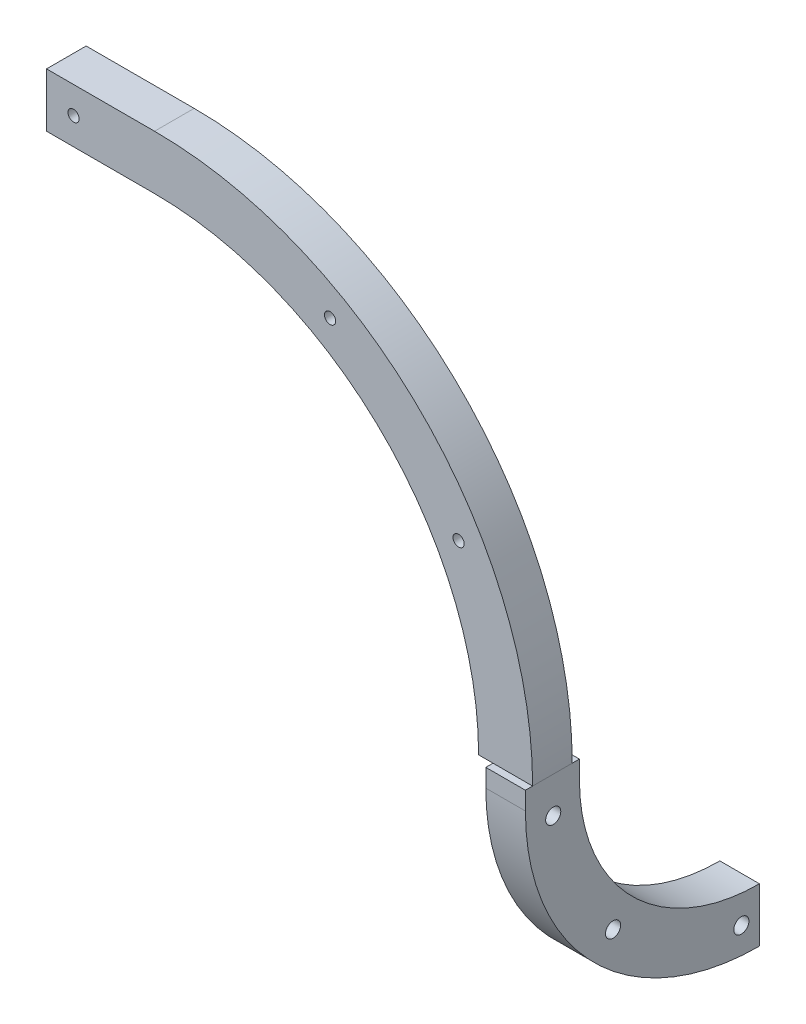
ISO-10303-21;
HEADER;
FILE_DESCRIPTION(('STEP AP214'),'2;1');
FILE_NAME('part.step','',(''),(''),'','','');
FILE_SCHEMA(('AUTOMOTIVE_DESIGN { 1 0 10303 214 1 1 1 1 }'));
ENDSEC;
DATA;
#1=APPLICATION_CONTEXT('core data for automotive mechanical design processes');
#2=APPLICATION_PROTOCOL_DEFINITION('international standard','automotive_design',2000,#1);
#3=PRODUCT_CONTEXT('',#1,'mechanical');
#4=PRODUCT('Part','Part','',(#3));
#5=PRODUCT_RELATED_PRODUCT_CATEGORY('part','',(#4));
#6=PRODUCT_DEFINITION_FORMATION('','',#4);
#7=PRODUCT_DEFINITION_CONTEXT('part definition',#1,'design');
#8=PRODUCT_DEFINITION('design','',#6,#7);
#9=PRODUCT_DEFINITION_SHAPE('','',#8);
#10=(LENGTH_UNIT() NAMED_UNIT(*) SI_UNIT(.MILLI.,.METRE.));
#11=(NAMED_UNIT(*) PLANE_ANGLE_UNIT() SI_UNIT($,.RADIAN.));
#12=(NAMED_UNIT(*) SI_UNIT($,.STERADIAN.) SOLID_ANGLE_UNIT());
#13=UNCERTAINTY_MEASURE_WITH_UNIT(LENGTH_MEASURE(1.E-05),#10,'distance_accuracy_value','');
#14=(GEOMETRIC_REPRESENTATION_CONTEXT(3) GLOBAL_UNCERTAINTY_ASSIGNED_CONTEXT((#13)) GLOBAL_UNIT_ASSIGNED_CONTEXT((#10,
#11,#12)) REPRESENTATION_CONTEXT('',''));
#15=CARTESIAN_POINT('',(0.,0.,0.));
#16=DIRECTION('',(0.,0.,1.));
#17=DIRECTION('',(1.,0.,0.));
#18=AXIS2_PLACEMENT_3D('',#15,#16,#17);
#19=CARTESIAN_POINT('',(0.,-45.6586399182266,-9.3413600817736));
#20=DIRECTION('',(1.,0.,0.));
#21=DIRECTION('',(0.,0.,-1.));
#22=AXIS2_PLACEMENT_3D('',#19,#20,#21);
#23=CYLINDRICAL_SURFACE('',#22,1.55);
#24=CARTESIAN_POINT('',(94.,-45.6586399182266,-9.3413600817736));
#25=DIRECTION('',(-1.,0.,0.));
#26=DIRECTION('',(0.,0.,1.));
#27=AXIS2_PLACEMENT_3D('',#24,#25,#26);
#28=CIRCLE('',#27,1.55);
#29=CARTESIAN_POINT('',(94.,-45.6586399182266,-7.7913600817736));
#30=VERTEX_POINT('',#29);
#31=EDGE_CURVE('E316',#30,#30,#28,.F.);
#32=ORIENTED_EDGE('',*,*,#31,.F.);
#33=EDGE_LOOP('',(#32));
#34=FACE_BOUND('',#33,.T.);
#35=CARTESIAN_POINT('',(100.5,-45.6586399182266,-9.3413600817736));
#36=DIRECTION('',(1.,0.,0.));
#37=DIRECTION('',(0.,0.,-1.));
#38=AXIS2_PLACEMENT_3D('',#35,#36,#37);
#39=CIRCLE('',#38,1.55);
#40=CARTESIAN_POINT('',(100.5,-45.6586399182266,-10.8913600817736));
#41=VERTEX_POINT('',#40);
#42=EDGE_CURVE('E156',#41,#41,#39,.F.);
#43=ORIENTED_EDGE('',*,*,#42,.F.);
#44=EDGE_LOOP('',(#43));
#45=FACE_BOUND('',#44,.T.);
#46=ADVANCED_FACE('F45',(#34,#45),#23,.F.);
#47=CARTESIAN_POINT('',(0.,-10.01145520799,7.2811951402754));
#48=DIRECTION('',(1.,0.,0.));
#49=DIRECTION('',(0.,0.,-1.));
#50=AXIS2_PLACEMENT_3D('',#47,#48,#49);
#51=CYLINDRICAL_SURFACE('',#50,1.55);
#52=CARTESIAN_POINT('',(94.,-10.01145520799,7.2811951402754));
#53=DIRECTION('',(-1.,0.,0.));
#54=DIRECTION('',(0.,0.,1.));
#55=AXIS2_PLACEMENT_3D('',#52,#53,#54);
#56=CIRCLE('',#55,1.55);
#57=CARTESIAN_POINT('',(94.,-10.01145520799,8.8311951402754));
#58=VERTEX_POINT('',#57);
#59=EDGE_CURVE('E208',#58,#58,#56,.F.);
#60=ORIENTED_EDGE('',*,*,#59,.F.);
#61=EDGE_LOOP('',(#60));
#62=FACE_BOUND('',#61,.T.);
#63=CARTESIAN_POINT('',(100.5,-10.01145520799,7.2811951402754));
#64=DIRECTION('',(1.,0.,0.));
#65=DIRECTION('',(0.,0.,-1.));
#66=AXIS2_PLACEMENT_3D('',#63,#64,#65);
#67=CIRCLE('',#66,1.55);
#68=CARTESIAN_POINT('',(100.5,-10.01145520799,5.7311951402754));
#69=VERTEX_POINT('',#68);
#70=EDGE_CURVE('E219',#69,#69,#67,.F.);
#71=ORIENTED_EDGE('',*,*,#70,.F.);
#72=EDGE_LOOP('',(#71));
#73=FACE_BOUND('',#72,.T.);
#74=ADVANCED_FACE('F232',(#62,#73),#51,.F.);
#75=CARTESIAN_POINT('',(0.,-62.5,-44.9694018472598));
#76=DIRECTION('',(1.,0.,0.));
#77=DIRECTION('',(0.,0.,-1.));
#78=AXIS2_PLACEMENT_3D('',#75,#76,#77);
#79=CYLINDRICAL_SURFACE('',#78,1.55);
#80=CARTESIAN_POINT('',(94.,-62.5,-44.9694018472598));
#81=DIRECTION('',(-1.,0.,0.));
#82=DIRECTION('',(0.,0.,1.));
#83=AXIS2_PLACEMENT_3D('',#80,#81,#82);
#84=CIRCLE('',#83,1.55);
#85=CARTESIAN_POINT('',(94.,-62.5,-43.4194018472598));
#86=VERTEX_POINT('',#85);
#87=EDGE_CURVE('E167',#86,#86,#84,.F.);
#88=ORIENTED_EDGE('',*,*,#87,.F.);
#89=EDGE_LOOP('',(#88));
#90=FACE_BOUND('',#89,.T.);
#91=CARTESIAN_POINT('',(100.5,-62.5,-44.9694018472598));
#92=DIRECTION('',(1.,0.,0.));
#93=DIRECTION('',(0.,0.,-1.));
#94=AXIS2_PLACEMENT_3D('',#91,#92,#93);
#95=CIRCLE('',#94,1.55);
#96=CARTESIAN_POINT('',(100.5,-62.5,-46.5194018472598));
#97=VERTEX_POINT('',#96);
#98=EDGE_CURVE('E215',#97,#97,#95,.F.);
#99=ORIENTED_EDGE('',*,*,#98,.F.);
#100=EDGE_LOOP('',(#99));
#101=FACE_BOUND('',#100,.T.);
#102=ADVANCED_FACE('F237',(#90,#101),#79,.F.);
#103=CARTESIAN_POINT('',(0.,0.,0.));
#104=DIRECTION('',(0.,0.,-1.));
#105=DIRECTION('',(-1.,0.,0.));
#106=AXIS2_PLACEMENT_3D('',#103,#104,#105);
#107=PLANE('',#106);
#108=DIRECTION('',(1.,0.,0.));
#109=VECTOR('',#108,1.);
#110=CARTESIAN_POINT('',(90.,-5.,0.));
#111=LINE('',#110,#109);
#112=CARTESIAN_POINT('',(94.,-5.,0.));
#113=VERTEX_POINT('',#112);
#114=CARTESIAN_POINT('',(105.,-5.,0.));
#115=VERTEX_POINT('',#114);
#116=EDGE_CURVE('E174',#113,#115,#111,.T.);
#117=ORIENTED_EDGE('',*,*,#116,.F.);
#118=DIRECTION('',(0.,1.,0.));
#119=VECTOR('',#118,1.);
#120=CARTESIAN_POINT('',(94.,0.,0.));
#121=LINE('',#120,#119);
#122=CARTESIAN_POINT('',(94.,0.,0.));
#123=VERTEX_POINT('',#122);
#124=EDGE_CURVE('E361',#113,#123,#121,.T.);
#125=ORIENTED_EDGE('',*,*,#124,.T.);
#126=DIRECTION('',(1.,0.,0.));
#127=VECTOR('',#126,1.);
#128=CARTESIAN_POINT('',(90.,0.,0.));
#129=LINE('',#128,#127);
#130=CARTESIAN_POINT('',(105.,0.,0.));
#131=VERTEX_POINT('',#130);
#132=EDGE_CURVE('E295',#123,#131,#129,.T.);
#133=ORIENTED_EDGE('',*,*,#132,.T.);
#134=DIRECTION('',(0.,1.,0.));
#135=VECTOR('',#134,1.);
#136=CARTESIAN_POINT('',(105.,-5.,0.));
#137=LINE('',#136,#135);
#138=EDGE_CURVE('E178',#115,#131,#137,.T.);
#139=ORIENTED_EDGE('',*,*,#138,.F.);
#140=EDGE_LOOP('',(#117,#125,#133,#139));
#141=FACE_BOUND('',#140,.T.);
#142=ADVANCED_FACE('F270',(#141),#107,.T.);
#143=CARTESIAN_POINT('',(0.,0.,15.));
#144=DIRECTION('',(0.,0.,-1.));
#145=DIRECTION('',(-1.,0.,0.));
#146=AXIS2_PLACEMENT_3D('',#143,#144,#145);
#147=PLANE('',#146);
#148=DIRECTION('',(0.,-1.,0.));
#149=VECTOR('',#148,1.);
#150=CARTESIAN_POINT('',(94.,0.,15.));
#151=LINE('',#150,#149);
#152=CARTESIAN_POINT('',(94.,0.,15.));
#153=VERTEX_POINT('',#152);
#154=CARTESIAN_POINT('',(94.,-5.,15.));
#155=VERTEX_POINT('',#154);
#156=EDGE_CURVE('E145',#153,#155,#151,.T.);
#157=ORIENTED_EDGE('',*,*,#156,.T.);
#158=DIRECTION('',(-1.,0.,0.));
#159=VECTOR('',#158,1.);
#160=CARTESIAN_POINT('',(90.,-5.,15.));
#161=LINE('',#160,#159);
#162=CARTESIAN_POINT('',(105.,-5.,15.));
#163=VERTEX_POINT('',#162);
#164=EDGE_CURVE('E150',#163,#155,#161,.T.);
#165=ORIENTED_EDGE('',*,*,#164,.F.);
#166=DIRECTION('',(0.,1.,0.));
#167=VECTOR('',#166,1.);
#168=CARTESIAN_POINT('',(105.,-5.,15.));
#169=LINE('',#168,#167);
#170=CARTESIAN_POINT('',(105.,0.,15.));
#171=VERTEX_POINT('',#170);
#172=EDGE_CURVE('E173',#163,#171,#169,.T.);
#173=ORIENTED_EDGE('',*,*,#172,.T.);
#174=DIRECTION('',(1.,0.,0.));
#175=VECTOR('',#174,1.);
#176=CARTESIAN_POINT('',(90.,0.,15.));
#177=LINE('',#176,#175);
#178=EDGE_CURVE('E152',#153,#171,#177,.T.);
#179=ORIENTED_EDGE('',*,*,#178,.F.);
#180=EDGE_LOOP('',(#157,#165,#173,#179));
#181=FACE_BOUND('',#180,.T.);
#182=ADVANCED_FACE('F147',(#181),#147,.F.);
#183=CARTESIAN_POINT('',(90.,0.,13.));
#184=DIRECTION('',(0.,-1.,0.));
#185=DIRECTION('',(0.,0.,-1.));
#186=AXIS2_PLACEMENT_3D('',#183,#184,#185);
#187=PLANE('',#186);
#188=DIRECTION('',(0.,0.,1.));
#189=VECTOR('',#188,1.);
#190=CARTESIAN_POINT('',(94.,0.,0.));
#191=LINE('',#190,#189);
#192=CARTESIAN_POINT('',(94.,0.,13.));
#193=VERTEX_POINT('',#192);
#194=EDGE_CURVE('E155',#193,#153,#191,.T.);
#195=ORIENTED_EDGE('',*,*,#194,.T.);
#196=ORIENTED_EDGE('',*,*,#178,.T.);
#197=DIRECTION('',(0.,0.,-1.));
#198=VECTOR('',#197,1.);
#199=CARTESIAN_POINT('',(105.,0.,15.));
#200=LINE('',#199,#198);
#201=CARTESIAN_POINT('',(105.,0.,13.));
#202=VERTEX_POINT('',#201);
#203=EDGE_CURVE('E189',#171,#202,#200,.T.);
#204=ORIENTED_EDGE('',*,*,#203,.T.);
#205=DIRECTION('',(1.,0.,0.));
#206=VECTOR('',#205,1.);
#207=CARTESIAN_POINT('',(90.,0.,13.));
#208=LINE('',#207,#206);
#209=EDGE_CURVE('E326',#193,#202,#208,.T.);
#210=ORIENTED_EDGE('',*,*,#209,.F.);
#211=EDGE_LOOP('',(#195,#196,#204,#210));
#212=FACE_BOUND('',#211,.T.);
#213=ADVANCED_FACE('F269',(#212),#187,.F.);
#214=CARTESIAN_POINT('',(90.,0.,2.));
#215=DIRECTION('',(0.,1.,0.));
#216=DIRECTION('',(0.,0.,1.));
#217=AXIS2_PLACEMENT_3D('',#214,#215,#216);
#218=PLANE('',#217);
#219=ORIENTED_EDGE('',*,*,#132,.F.);
#220=CARTESIAN_POINT('',(94.,0.,2.));
#221=VERTEX_POINT('',#220);
#222=EDGE_CURVE('E434',#123,#221,#191,.T.);
#223=ORIENTED_EDGE('',*,*,#222,.T.);
#224=DIRECTION('',(1.,0.,0.));
#225=VECTOR('',#224,1.);
#226=CARTESIAN_POINT('',(90.,0.,2.));
#227=LINE('',#226,#225);
#228=CARTESIAN_POINT('',(105.,0.,2.));
#229=VERTEX_POINT('',#228);
#230=EDGE_CURVE('E71',#221,#229,#227,.T.);
#231=ORIENTED_EDGE('',*,*,#230,.T.);
#232=DIRECTION('',(0.,0.,-1.));
#233=VECTOR('',#232,1.);
#234=CARTESIAN_POINT('',(105.,0.,2.));
#235=LINE('',#234,#233);
#236=EDGE_CURVE('E214',#229,#131,#235,.T.);
#237=ORIENTED_EDGE('',*,*,#236,.T.);
#238=EDGE_LOOP('',(#219,#223,#231,#237));
#239=FACE_BOUND('',#238,.T.);
#240=ADVANCED_FACE('F277',(#239),#218,.T.);
#241=CARTESIAN_POINT('',(0.,0.,15.));
#242=DIRECTION('',(0.,0.,-1.));
#243=DIRECTION('',(-1.,0.,0.));
#244=AXIS2_PLACEMENT_3D('',#241,#242,#243);
#245=CYLINDRICAL_SURFACE('',#244,105.);
#246=CARTESIAN_POINT('',(0.,0.,2.));
#247=DIRECTION('',(0.,0.,1.));
#248=DIRECTION('',(-1.,0.,0.));
#249=AXIS2_PLACEMENT_3D('',#246,#247,#248);
#250=CIRCLE('',#249,105.);
#251=CARTESIAN_POINT('',(0.,105.,2.));
#252=VERTEX_POINT('',#251);
#253=EDGE_CURVE('E288',#229,#252,#250,.T.);
#254=ORIENTED_EDGE('',*,*,#253,.T.);
#255=DIRECTION('',(0.,0.,-1.));
#256=VECTOR('',#255,1.);
#257=CARTESIAN_POINT('',(0.,105.,15.));
#258=LINE('',#257,#256);
#259=CARTESIAN_POINT('',(0.,105.,13.));
#260=VERTEX_POINT('',#259);
#261=EDGE_CURVE('E11',#260,#252,#258,.T.);
#262=ORIENTED_EDGE('',*,*,#261,.F.);
#263=CARTESIAN_POINT('',(0.,0.,13.));
#264=DIRECTION('',(0.,0.,1.));
#265=DIRECTION('',(-1.,0.,0.));
#266=AXIS2_PLACEMENT_3D('',#263,#264,#265);
#267=CIRCLE('',#266,105.);
#268=EDGE_CURVE('E320',#202,#260,#267,.T.);
#269=ORIENTED_EDGE('',*,*,#268,.F.);
#270=EDGE_CURVE('E188',#202,#229,#200,.T.);
#271=ORIENTED_EDGE('',*,*,#270,.T.);
#272=EDGE_LOOP('',(#254,#262,#269,#271));
#273=FACE_BOUND('',#272,.T.);
#274=ADVANCED_FACE('F47',(#273),#245,.T.);
#275=CARTESIAN_POINT('',(0.,0.,15.));
#276=DIRECTION('',(0.,0.,-1.));
#277=DIRECTION('',(-1.,0.,0.));
#278=AXIS2_PLACEMENT_3D('',#275,#276,#277);
#279=CYLINDRICAL_SURFACE('',#278,90.);
#280=CARTESIAN_POINT('',(0.,0.,2.));
#281=DIRECTION('',(0.,0.,-1.));
#282=DIRECTION('',(-1.,0.,0.));
#283=AXIS2_PLACEMENT_3D('',#280,#281,#282);
#284=CIRCLE('',#283,90.);
#285=CARTESIAN_POINT('',(-3.14233320495882E-13,90.,2.));
#286=VERTEX_POINT('',#285);
#287=CARTESIAN_POINT('',(90.,0.,2.));
#288=VERTEX_POINT('',#287);
#289=EDGE_CURVE('E281',#286,#288,#284,.T.);
#290=ORIENTED_EDGE('',*,*,#289,.T.);
#291=DIRECTION('',(0.,0.,-1.));
#292=VECTOR('',#291,1.);
#293=CARTESIAN_POINT('',(90.,0.,15.));
#294=LINE('',#293,#292);
#295=CARTESIAN_POINT('',(90.,0.,13.));
#296=VERTEX_POINT('',#295);
#297=EDGE_CURVE('E193',#296,#288,#294,.T.);
#298=ORIENTED_EDGE('',*,*,#297,.F.);
#299=CARTESIAN_POINT('',(0.,0.,13.));
#300=DIRECTION('',(0.,0.,-1.));
#301=DIRECTION('',(-1.,0.,0.));
#302=AXIS2_PLACEMENT_3D('',#299,#300,#301);
#303=CIRCLE('',#302,90.);
#304=CARTESIAN_POINT('',(-3.14233320495882E-13,90.,13.));
#305=VERTEX_POINT('',#304);
#306=EDGE_CURVE('E322',#305,#296,#303,.T.);
#307=ORIENTED_EDGE('',*,*,#306,.F.);
#308=DIRECTION('',(0.,0.,-1.));
#309=VECTOR('',#308,1.);
#310=CARTESIAN_POINT('',(0.,90.,15.));
#311=LINE('',#310,#309);
#312=EDGE_CURVE('E55',#305,#286,#311,.T.);
#313=ORIENTED_EDGE('',*,*,#312,.T.);
#314=EDGE_LOOP('',(#290,#298,#307,#313));
#315=FACE_BOUND('',#314,.T.);
#316=ADVANCED_FACE('F251',(#315),#279,.F.);
#317=CARTESIAN_POINT('',(84.4374768689824,48.7500000000007,-50.));
#318=DIRECTION('',(0.,0.,1.));
#319=DIRECTION('',(1.,0.,0.));
#320=AXIS2_PLACEMENT_3D('',#317,#318,#319);
#321=CYLINDRICAL_SURFACE('',#320,1.54999999999999);
#322=CARTESIAN_POINT('',(84.4374768689824,48.7500000000007,13.));
#323=DIRECTION('',(0.,0.,-1.));
#324=DIRECTION('',(-1.,0.,0.));
#325=AXIS2_PLACEMENT_3D('',#322,#323,#324);
#326=CIRCLE('',#325,1.54999999999999);
#327=CARTESIAN_POINT('',(82.8874768689824,48.7500000000007,13.));
#328=VERTEX_POINT('',#327);
#329=EDGE_CURVE('E203',#328,#328,#326,.F.);
#330=ORIENTED_EDGE('',*,*,#329,.T.);
#331=EDGE_LOOP('',(#330));
#332=FACE_BOUND('',#331,.T.);
#333=CARTESIAN_POINT('',(84.4374768689824,48.7500000000007,2.));
#334=DIRECTION('',(0.,0.,-1.));
#335=DIRECTION('',(-1.,0.,0.));
#336=AXIS2_PLACEMENT_3D('',#333,#334,#335);
#337=CIRCLE('',#336,1.54999999999999);
#338=CARTESIAN_POINT('',(82.8874768689824,48.7500000000007,2.));
#339=VERTEX_POINT('',#338);
#340=EDGE_CURVE('E213',#339,#339,#337,.F.);
#341=ORIENTED_EDGE('',*,*,#340,.F.);
#342=EDGE_LOOP('',(#341));
#343=FACE_BOUND('',#342,.T.);
#344=ADVANCED_FACE('F247',(#332,#343),#321,.F.);
#345=CARTESIAN_POINT('',(48.7500000000004,84.4374768689825,-50.));
#346=DIRECTION('',(0.,0.,1.));
#347=DIRECTION('',(1.,0.,0.));
#348=AXIS2_PLACEMENT_3D('',#345,#346,#347);
#349=CYLINDRICAL_SURFACE('',#348,1.54999999999999);
#350=CARTESIAN_POINT('',(48.7500000000004,84.4374768689825,13.));
#351=DIRECTION('',(0.,0.,-1.));
#352=DIRECTION('',(-1.,0.,0.));
#353=AXIS2_PLACEMENT_3D('',#350,#351,#352);
#354=CIRCLE('',#353,1.54999999999999);
#355=CARTESIAN_POINT('',(47.2000000000004,84.4374768689825,13.));
#356=VERTEX_POINT('',#355);
#357=EDGE_CURVE('E199',#356,#356,#354,.F.);
#358=ORIENTED_EDGE('',*,*,#357,.T.);
#359=EDGE_LOOP('',(#358));
#360=FACE_BOUND('',#359,.T.);
#361=CARTESIAN_POINT('',(48.7500000000004,84.4374768689825,2.));
#362=DIRECTION('',(0.,0.,-1.));
#363=DIRECTION('',(-1.,0.,0.));
#364=AXIS2_PLACEMENT_3D('',#361,#362,#363);
#365=CIRCLE('',#364,1.54999999999999);
#366=CARTESIAN_POINT('',(47.2000000000004,84.4374768689825,2.));
#367=VERTEX_POINT('',#366);
#368=EDGE_CURVE('E209',#367,#367,#365,.F.);
#369=ORIENTED_EDGE('',*,*,#368,.F.);
#370=EDGE_LOOP('',(#369));
#371=FACE_BOUND('',#370,.T.);
#372=ADVANCED_FACE('F243',(#360,#371),#349,.F.);
#373=CARTESIAN_POINT('',(90.,-5.,-50.));
#374=DIRECTION('',(1.,0.,0.));
#375=DIRECTION('',(0.,0.,-1.));
#376=AXIS2_PLACEMENT_3D('',#373,#374,#375);
#377=CYLINDRICAL_SURFACE('',#376,50.);
#378=DIRECTION('',(1.,0.,0.));
#379=VECTOR('',#378,1.);
#380=CARTESIAN_POINT('',(90.,-55.,-50.));
#381=LINE('',#380,#379);
#382=CARTESIAN_POINT('',(94.,-55.,-50.));
#383=VERTEX_POINT('',#382);
#384=CARTESIAN_POINT('',(105.,-55.,-50.));
#385=VERTEX_POINT('',#384);
#386=EDGE_CURVE('E181',#383,#385,#381,.T.);
#387=ORIENTED_EDGE('',*,*,#386,.F.);
#388=CARTESIAN_POINT('',(94.,-5.,-50.));
#389=DIRECTION('',(1.,0.,0.));
#390=DIRECTION('',(0.,0.,1.));
#391=AXIS2_PLACEMENT_3D('',#388,#389,#390);
#392=CIRCLE('',#391,50.);
#393=EDGE_CURVE('E308',#113,#383,#392,.T.);
#394=ORIENTED_EDGE('',*,*,#393,.F.);
#395=ORIENTED_EDGE('',*,*,#116,.T.);
#396=CARTESIAN_POINT('',(105.,-5.,-50.));
#397=DIRECTION('',(-1.,0.,0.));
#398=DIRECTION('',(0.,0.,-1.));
#399=AXIS2_PLACEMENT_3D('',#396,#397,#398);
#400=CIRCLE('',#399,50.);
#401=EDGE_CURVE('E335',#385,#115,#400,.T.);
#402=ORIENTED_EDGE('',*,*,#401,.F.);
#403=EDGE_LOOP('',(#387,#394,#395,#402));
#404=FACE_BOUND('',#403,.T.);
#405=ADVANCED_FACE('F246',(#404),#377,.F.);
#406=CARTESIAN_POINT('',(90.,-55.,-50.));
#407=DIRECTION('',(0.,0.,-1.));
#408=DIRECTION('',(0.,1.,0.));
#409=AXIS2_PLACEMENT_3D('',#406,#407,#408);
#410=PLANE('',#409);
#411=DIRECTION('',(1.,0.,0.));
#412=VECTOR('',#411,1.);
#413=CARTESIAN_POINT('',(90.,-70.,-50.));
#414=LINE('',#413,#412);
#415=CARTESIAN_POINT('',(94.,-70.,-50.));
#416=VERTEX_POINT('',#415);
#417=CARTESIAN_POINT('',(105.,-70.,-50.));
#418=VERTEX_POINT('',#417);
#419=EDGE_CURVE('E345',#416,#418,#414,.T.);
#420=ORIENTED_EDGE('',*,*,#419,.F.);
#421=DIRECTION('',(0.,-1.,0.));
#422=VECTOR('',#421,1.);
#423=CARTESIAN_POINT('',(94.,-55.,-50.));
#424=LINE('',#423,#422);
#425=EDGE_CURVE('E163',#383,#416,#424,.T.);
#426=ORIENTED_EDGE('',*,*,#425,.F.);
#427=ORIENTED_EDGE('',*,*,#386,.T.);
#428=DIRECTION('',(0.,1.,0.));
#429=VECTOR('',#428,1.);
#430=CARTESIAN_POINT('',(105.,-55.,-50.));
#431=LINE('',#430,#429);
#432=EDGE_CURVE('E341',#418,#385,#431,.T.);
#433=ORIENTED_EDGE('',*,*,#432,.F.);
#434=EDGE_LOOP('',(#420,#426,#427,#433));
#435=FACE_BOUND('',#434,.T.);
#436=ADVANCED_FACE('F253',(#435),#410,.T.);
#437=CARTESIAN_POINT('',(90.,-5.,-50.));
#438=DIRECTION('',(1.,0.,0.));
#439=DIRECTION('',(0.,0.,-1.));
#440=AXIS2_PLACEMENT_3D('',#437,#438,#439);
#441=CYLINDRICAL_SURFACE('',#440,65.);
#442=ORIENTED_EDGE('',*,*,#164,.T.);
#443=CARTESIAN_POINT('',(94.,-5.,-50.));
#444=DIRECTION('',(-1.,0.,0.));
#445=DIRECTION('',(0.,0.,1.));
#446=AXIS2_PLACEMENT_3D('',#443,#444,#445);
#447=CIRCLE('',#446,65.);
#448=EDGE_CURVE('E159',#416,#155,#447,.T.);
#449=ORIENTED_EDGE('',*,*,#448,.F.);
#450=ORIENTED_EDGE('',*,*,#419,.T.);
#451=CARTESIAN_POINT('',(105.,-5.,-50.));
#452=DIRECTION('',(1.,0.,0.));
#453=DIRECTION('',(0.,0.,-1.));
#454=AXIS2_PLACEMENT_3D('',#451,#452,#453);
#455=CIRCLE('',#454,65.);
#456=EDGE_CURVE('E171',#163,#418,#455,.T.);
#457=ORIENTED_EDGE('',*,*,#456,.F.);
#458=EDGE_LOOP('',(#442,#449,#450,#457));
#459=FACE_BOUND('',#458,.T.);
#460=ADVANCED_FACE('F169',(#459),#441,.T.);
#461=CARTESIAN_POINT('',(105.,-5.,15.));
#462=DIRECTION('',(-1.,0.,0.));
#463=DIRECTION('',(0.,0.,1.));
#464=AXIS2_PLACEMENT_3D('',#461,#462,#463);
#465=PLANE('',#464);
#466=CARTESIAN_POINT('',(105.,-10.01145520799,7.2811951402754));
#467=DIRECTION('',(1.,0.,0.));
#468=DIRECTION('',(0.,0.,-1.));
#469=AXIS2_PLACEMENT_3D('',#466,#467,#468);
#470=CIRCLE('',#469,2.1);
#471=CARTESIAN_POINT('',(105.,-10.01145520799,5.1811951402754));
#472=VERTEX_POINT('',#471);
#473=EDGE_CURVE('E457',#472,#472,#470,.T.);
#474=ORIENTED_EDGE('',*,*,#473,.F.);
#475=EDGE_LOOP('',(#474));
#476=FACE_BOUND('',#475,.T.);
#477=CARTESIAN_POINT('',(105.,-45.6586399182266,-9.3413600817736));
#478=DIRECTION('',(1.,0.,0.));
#479=DIRECTION('',(0.,0.,-1.));
#480=AXIS2_PLACEMENT_3D('',#477,#478,#479);
#481=CIRCLE('',#480,2.1);
#482=CARTESIAN_POINT('',(105.,-45.6586399182266,-11.4413600817736));
#483=VERTEX_POINT('',#482);
#484=EDGE_CURVE('E450',#483,#483,#481,.T.);
#485=ORIENTED_EDGE('',*,*,#484,.F.);
#486=EDGE_LOOP('',(#485));
#487=FACE_BOUND('',#486,.T.);
#488=CARTESIAN_POINT('',(105.,-62.5,-44.9694018472598));
#489=DIRECTION('',(1.,0.,0.));
#490=DIRECTION('',(0.,0.,-1.));
#491=AXIS2_PLACEMENT_3D('',#488,#489,#490);
#492=CIRCLE('',#491,2.1);
#493=CARTESIAN_POINT('',(105.,-62.5,-47.0694018472598));
#494=VERTEX_POINT('',#493);
#495=EDGE_CURVE('E451',#494,#494,#492,.T.);
#496=ORIENTED_EDGE('',*,*,#495,.F.);
#497=EDGE_LOOP('',(#496));
#498=FACE_BOUND('',#497,.T.);
#499=ORIENTED_EDGE('',*,*,#203,.F.);
#500=ORIENTED_EDGE('',*,*,#172,.F.);
#501=ORIENTED_EDGE('',*,*,#456,.T.);
#502=ORIENTED_EDGE('',*,*,#432,.T.);
#503=ORIENTED_EDGE('',*,*,#401,.T.);
#504=ORIENTED_EDGE('',*,*,#138,.T.);
#505=ORIENTED_EDGE('',*,*,#236,.F.);
#506=ORIENTED_EDGE('',*,*,#270,.F.);
#507=EDGE_LOOP('',(#499,#500,#501,#502,#503,#504,#505,#506));
#508=FACE_BOUND('',#507,.T.);
#509=ADVANCED_FACE('F259',(#476,#487,#498,#508),#465,.F.);
#510=CARTESIAN_POINT('',(0.,0.,13.));
#511=DIRECTION('',(0.,0.,-1.));
#512=DIRECTION('',(-1.,0.,0.));
#513=AXIS2_PLACEMENT_3D('',#510,#511,#512);
#514=PLANE('',#513);
#515=CARTESIAN_POINT('',(-22.5,97.5,13.));
#516=DIRECTION('',(0.,0.,1.));
#517=DIRECTION('',(1.,0.,0.));
#518=AXIS2_PLACEMENT_3D('',#515,#516,#517);
#519=CIRCLE('',#518,1.55);
#520=CARTESIAN_POINT('',(-20.95,97.5,13.));
#521=VERTEX_POINT('',#520);
#522=EDGE_CURVE('E380',#521,#521,#519,.T.);
#523=ORIENTED_EDGE('',*,*,#522,.F.);
#524=EDGE_LOOP('',(#523));
#525=FACE_BOUND('',#524,.T.);
#526=ORIENTED_EDGE('',*,*,#357,.F.);
#527=EDGE_LOOP('',(#526));
#528=FACE_BOUND('',#527,.T.);
#529=ORIENTED_EDGE('',*,*,#268,.T.);
#530=DIRECTION('',(1.,0.,0.));
#531=VECTOR('',#530,1.);
#532=CARTESIAN_POINT('',(-30.,105.,13.));
#533=LINE('',#532,#531);
#534=CARTESIAN_POINT('',(-30.,105.,13.));
#535=VERTEX_POINT('',#534);
#536=EDGE_CURVE('E410',#535,#260,#533,.T.);
#537=ORIENTED_EDGE('',*,*,#536,.F.);
#538=DIRECTION('',(0.,1.,0.));
#539=VECTOR('',#538,1.);
#540=CARTESIAN_POINT('',(-30.,105.,13.));
#541=LINE('',#540,#539);
#542=CARTESIAN_POINT('',(-30.,90.,13.));
#543=VERTEX_POINT('',#542);
#544=EDGE_CURVE('E431',#543,#535,#541,.T.);
#545=ORIENTED_EDGE('',*,*,#544,.F.);
#546=DIRECTION('',(1.,0.,0.));
#547=VECTOR('',#546,1.);
#548=CARTESIAN_POINT('',(-30.,90.,13.));
#549=LINE('',#548,#547);
#550=EDGE_CURVE('E414',#543,#305,#549,.T.);
#551=ORIENTED_EDGE('',*,*,#550,.T.);
#552=ORIENTED_EDGE('',*,*,#306,.T.);
#553=EDGE_CURVE('E204',#296,#193,#208,.T.);
#554=ORIENTED_EDGE('',*,*,#553,.T.);
#555=ORIENTED_EDGE('',*,*,#209,.T.);
#556=EDGE_LOOP('',(#529,#537,#545,#551,#552,#554,#555));
#557=FACE_BOUND('',#556,.T.);
#558=ORIENTED_EDGE('',*,*,#329,.F.);
#559=EDGE_LOOP('',(#558));
#560=FACE_BOUND('',#559,.T.);
#561=ADVANCED_FACE('F265',(#525,#528,#557,#560),#514,.F.);
#562=CARTESIAN_POINT('',(94.,-5.,-50.));
#563=DIRECTION('',(-1.,0.,0.));
#564=DIRECTION('',(0.,0.,1.));
#565=AXIS2_PLACEMENT_3D('',#562,#563,#564);
#566=PLANE('',#565);
#567=ORIENTED_EDGE('',*,*,#393,.T.);
#568=ORIENTED_EDGE('',*,*,#425,.T.);
#569=ORIENTED_EDGE('',*,*,#448,.T.);
#570=ORIENTED_EDGE('',*,*,#156,.F.);
#571=ORIENTED_EDGE('',*,*,#194,.F.);
#572=EDGE_CURVE('E63',#221,#193,#191,.T.);
#573=ORIENTED_EDGE('',*,*,#572,.F.);
#574=ORIENTED_EDGE('',*,*,#222,.F.);
#575=ORIENTED_EDGE('',*,*,#124,.F.);
#576=EDGE_LOOP('',(#567,#568,#569,#570,#571,#573,#574,#575));
#577=FACE_BOUND('',#576,.T.);
#578=ORIENTED_EDGE('',*,*,#87,.T.);
#579=EDGE_LOOP('',(#578));
#580=FACE_BOUND('',#579,.T.);
#581=ORIENTED_EDGE('',*,*,#59,.T.);
#582=EDGE_LOOP('',(#581));
#583=FACE_BOUND('',#582,.T.);
#584=ORIENTED_EDGE('',*,*,#31,.T.);
#585=EDGE_LOOP('',(#584));
#586=FACE_BOUND('',#585,.T.);
#587=ADVANCED_FACE('F160',(#577,#580,#583,#586),#566,.T.);
#588=CARTESIAN_POINT('',(0.,0.,2.));
#589=DIRECTION('',(0.,0.,-1.));
#590=DIRECTION('',(-1.,0.,0.));
#591=AXIS2_PLACEMENT_3D('',#588,#589,#590);
#592=PLANE('',#591);
#593=CARTESIAN_POINT('',(-22.5,97.5,2.));
#594=DIRECTION('',(0.,0.,-1.));
#595=DIRECTION('',(-1.,0.,0.));
#596=AXIS2_PLACEMENT_3D('',#593,#594,#595);
#597=CIRCLE('',#596,1.55);
#598=CARTESIAN_POINT('',(-24.05,97.5,2.));
#599=VERTEX_POINT('',#598);
#600=EDGE_CURVE('E49',#599,#599,#597,.T.);
#601=ORIENTED_EDGE('',*,*,#600,.F.);
#602=EDGE_LOOP('',(#601));
#603=FACE_BOUND('',#602,.T.);
#604=ORIENTED_EDGE('',*,*,#253,.F.);
#605=ORIENTED_EDGE('',*,*,#230,.F.);
#606=EDGE_CURVE('E292',#288,#221,#227,.T.);
#607=ORIENTED_EDGE('',*,*,#606,.F.);
#608=ORIENTED_EDGE('',*,*,#289,.F.);
#609=DIRECTION('',(1.,0.,0.));
#610=VECTOR('',#609,1.);
#611=CARTESIAN_POINT('',(-30.,90.,2.));
#612=LINE('',#611,#610);
#613=CARTESIAN_POINT('',(-30.,90.,2.));
#614=VERTEX_POINT('',#613);
#615=EDGE_CURVE('E302',#614,#286,#612,.T.);
#616=ORIENTED_EDGE('',*,*,#615,.F.);
#617=DIRECTION('',(0.,-1.,0.));
#618=VECTOR('',#617,1.);
#619=CARTESIAN_POINT('',(-30.,105.,2.));
#620=LINE('',#619,#618);
#621=CARTESIAN_POINT('',(-30.,105.,2.));
#622=VERTEX_POINT('',#621);
#623=EDGE_CURVE('E427',#622,#614,#620,.T.);
#624=ORIENTED_EDGE('',*,*,#623,.F.);
#625=DIRECTION('',(1.,0.,0.));
#626=VECTOR('',#625,1.);
#627=CARTESIAN_POINT('',(-30.,105.,2.));
#628=LINE('',#627,#626);
#629=EDGE_CURVE('E406',#622,#252,#628,.T.);
#630=ORIENTED_EDGE('',*,*,#629,.T.);
#631=EDGE_LOOP('',(#604,#605,#607,#608,#616,#624,#630));
#632=FACE_BOUND('',#631,.T.);
#633=ORIENTED_EDGE('',*,*,#368,.T.);
#634=EDGE_LOOP('',(#633));
#635=FACE_BOUND('',#634,.T.);
#636=ORIENTED_EDGE('',*,*,#340,.T.);
#637=EDGE_LOOP('',(#636));
#638=FACE_BOUND('',#637,.T.);
#639=ADVANCED_FACE('F370',(#603,#632,#635,#638),#592,.T.);
#640=CARTESIAN_POINT('',(-30.,90.,2.));
#641=DIRECTION('',(0.,1.,0.));
#642=DIRECTION('',(-1.,0.,0.));
#643=AXIS2_PLACEMENT_3D('',#640,#641,#642);
#644=PLANE('',#643);
#645=ORIENTED_EDGE('',*,*,#312,.F.);
#646=ORIENTED_EDGE('',*,*,#550,.F.);
#647=DIRECTION('',(0.,0.,1.));
#648=VECTOR('',#647,1.);
#649=CARTESIAN_POINT('',(-30.,90.,2.));
#650=LINE('',#649,#648);
#651=EDGE_CURVE('E425',#614,#543,#650,.T.);
#652=ORIENTED_EDGE('',*,*,#651,.F.);
#653=ORIENTED_EDGE('',*,*,#615,.T.);
#654=EDGE_LOOP('',(#645,#646,#652,#653));
#655=FACE_BOUND('',#654,.T.);
#656=ADVANCED_FACE('F392',(#655),#644,.F.);
#657=CARTESIAN_POINT('',(-30.,105.,2.));
#658=DIRECTION('',(0.,-1.,0.));
#659=DIRECTION('',(1.,0.,0.));
#660=AXIS2_PLACEMENT_3D('',#657,#658,#659);
#661=PLANE('',#660);
#662=ORIENTED_EDGE('',*,*,#261,.T.);
#663=ORIENTED_EDGE('',*,*,#629,.F.);
#664=DIRECTION('',(0.,0.,-1.));
#665=VECTOR('',#664,1.);
#666=CARTESIAN_POINT('',(-30.,105.,2.));
#667=LINE('',#666,#665);
#668=EDGE_CURVE('E411',#535,#622,#667,.T.);
#669=ORIENTED_EDGE('',*,*,#668,.F.);
#670=ORIENTED_EDGE('',*,*,#536,.T.);
#671=EDGE_LOOP('',(#662,#663,#669,#670));
#672=FACE_BOUND('',#671,.T.);
#673=ADVANCED_FACE('F396',(#672),#661,.F.);
#674=CARTESIAN_POINT('',(-30.,0.,0.));
#675=DIRECTION('',(-1.,0.,0.));
#676=DIRECTION('',(0.,-1.,0.));
#677=AXIS2_PLACEMENT_3D('',#674,#675,#676);
#678=PLANE('',#677);
#679=ORIENTED_EDGE('',*,*,#623,.T.);
#680=ORIENTED_EDGE('',*,*,#651,.T.);
#681=ORIENTED_EDGE('',*,*,#544,.T.);
#682=ORIENTED_EDGE('',*,*,#668,.T.);
#683=EDGE_LOOP('',(#679,#680,#681,#682));
#684=FACE_BOUND('',#683,.T.);
#685=ADVANCED_FACE('F440',(#684),#678,.T.);
#686=CARTESIAN_POINT('',(109.811388300842,0.,0.));
#687=DIRECTION('',(0.,1.,0.));
#688=DIRECTION('',(0.,0.,1.));
#689=AXIS2_PLACEMENT_3D('',#686,#687,#688);
#690=PLANE('',#689);
#691=ORIENTED_EDGE('',*,*,#297,.T.);
#692=ORIENTED_EDGE('',*,*,#606,.T.);
#693=ORIENTED_EDGE('',*,*,#572,.T.);
#694=ORIENTED_EDGE('',*,*,#553,.F.);
#695=EDGE_LOOP('',(#691,#692,#693,#694));
#696=FACE_BOUND('',#695,.T.);
#697=ADVANCED_FACE('F443',(#696),#690,.F.);
#698=CARTESIAN_POINT('',(100.5,-62.5,-44.9694018472598));
#699=DIRECTION('',(1.,0.,0.));
#700=DIRECTION('',(0.,0.,-1.));
#701=AXIS2_PLACEMENT_3D('',#698,#699,#700);
#702=PLANE('',#701);
#703=CARTESIAN_POINT('',(100.5,-62.5,-44.9694018472598));
#704=DIRECTION('',(1.,0.,0.));
#705=DIRECTION('',(0.,0.,-1.));
#706=AXIS2_PLACEMENT_3D('',#703,#704,#705);
#707=CIRCLE('',#706,2.1);
#708=CARTESIAN_POINT('',(100.5,-62.5,-47.0694018472598));
#709=VERTEX_POINT('',#708);
#710=EDGE_CURVE('E460',#709,#709,#707,.T.);
#711=ORIENTED_EDGE('',*,*,#710,.T.);
#712=EDGE_LOOP('',(#711));
#713=FACE_BOUND('',#712,.T.);
#714=ORIENTED_EDGE('',*,*,#98,.T.);
#715=EDGE_LOOP('',(#714));
#716=FACE_BOUND('',#715,.T.);
#717=ADVANCED_FACE('F487',(#713,#716),#702,.T.);
#718=CARTESIAN_POINT('',(100.5,-62.5,-44.9694018472598));
#719=DIRECTION('',(1.,0.,0.));
#720=DIRECTION('',(0.,0.,-1.));
#721=AXIS2_PLACEMENT_3D('',#718,#719,#720);
#722=CYLINDRICAL_SURFACE('',#721,2.1);
#723=ORIENTED_EDGE('',*,*,#710,.F.);
#724=EDGE_LOOP('',(#723));
#725=FACE_BOUND('',#724,.T.);
#726=ORIENTED_EDGE('',*,*,#495,.T.);
#727=EDGE_LOOP('',(#726));
#728=FACE_BOUND('',#727,.T.);
#729=ADVANCED_FACE('F485',(#725,#728),#722,.F.);
#730=CARTESIAN_POINT('',(100.5,-45.6586399182266,-9.3413600817736));
#731=DIRECTION('',(1.,0.,0.));
#732=DIRECTION('',(0.,0.,-1.));
#733=AXIS2_PLACEMENT_3D('',#730,#731,#732);
#734=PLANE('',#733);
#735=CARTESIAN_POINT('',(100.5,-45.6586399182266,-9.3413600817736));
#736=DIRECTION('',(1.,0.,0.));
#737=DIRECTION('',(0.,0.,-1.));
#738=AXIS2_PLACEMENT_3D('',#735,#736,#737);
#739=CIRCLE('',#738,2.1);
#740=CARTESIAN_POINT('',(100.5,-45.6586399182266,-11.4413600817736));
#741=VERTEX_POINT('',#740);
#742=EDGE_CURVE('E448',#741,#741,#739,.T.);
#743=ORIENTED_EDGE('',*,*,#742,.T.);
#744=EDGE_LOOP('',(#743));
#745=FACE_BOUND('',#744,.T.);
#746=ORIENTED_EDGE('',*,*,#42,.T.);
#747=EDGE_LOOP('',(#746));
#748=FACE_BOUND('',#747,.T.);
#749=ADVANCED_FACE('F229',(#745,#748),#734,.T.);
#750=CARTESIAN_POINT('',(100.5,-45.6586399182266,-9.3413600817736));
#751=DIRECTION('',(1.,0.,0.));
#752=DIRECTION('',(0.,0.,-1.));
#753=AXIS2_PLACEMENT_3D('',#750,#751,#752);
#754=CYLINDRICAL_SURFACE('',#753,2.1);
#755=ORIENTED_EDGE('',*,*,#742,.F.);
#756=EDGE_LOOP('',(#755));
#757=FACE_BOUND('',#756,.T.);
#758=ORIENTED_EDGE('',*,*,#484,.T.);
#759=EDGE_LOOP('',(#758));
#760=FACE_BOUND('',#759,.T.);
#761=ADVANCED_FACE('F493',(#757,#760),#754,.F.);
#762=CARTESIAN_POINT('',(100.5,-10.01145520799,7.2811951402754));
#763=DIRECTION('',(1.,0.,0.));
#764=DIRECTION('',(0.,0.,-1.));
#765=AXIS2_PLACEMENT_3D('',#762,#763,#764);
#766=PLANE('',#765);
#767=CARTESIAN_POINT('',(100.5,-10.01145520799,7.2811951402754));
#768=DIRECTION('',(1.,0.,0.));
#769=DIRECTION('',(0.,0.,-1.));
#770=AXIS2_PLACEMENT_3D('',#767,#768,#769);
#771=CIRCLE('',#770,2.1);
#772=CARTESIAN_POINT('',(100.5,-10.01145520799,5.1811951402754));
#773=VERTEX_POINT('',#772);
#774=EDGE_CURVE('E220',#773,#773,#771,.T.);
#775=ORIENTED_EDGE('',*,*,#774,.T.);
#776=EDGE_LOOP('',(#775));
#777=FACE_BOUND('',#776,.T.);
#778=ORIENTED_EDGE('',*,*,#70,.T.);
#779=EDGE_LOOP('',(#778));
#780=FACE_BOUND('',#779,.T.);
#781=ADVANCED_FACE('F542',(#777,#780),#766,.T.);
#782=CARTESIAN_POINT('',(100.5,-10.01145520799,7.2811951402754));
#783=DIRECTION('',(1.,0.,0.));
#784=DIRECTION('',(0.,0.,-1.));
#785=AXIS2_PLACEMENT_3D('',#782,#783,#784);
#786=CYLINDRICAL_SURFACE('',#785,2.1);
#787=ORIENTED_EDGE('',*,*,#774,.F.);
#788=EDGE_LOOP('',(#787));
#789=FACE_BOUND('',#788,.T.);
#790=ORIENTED_EDGE('',*,*,#473,.T.);
#791=EDGE_LOOP('',(#790));
#792=FACE_BOUND('',#791,.T.);
#793=ADVANCED_FACE('F479',(#789,#792),#786,.F.);
#794=CARTESIAN_POINT('',(-22.5,97.5,-50.));
#795=DIRECTION('',(0.,0.,1.));
#796=DIRECTION('',(1.,0.,0.));
#797=AXIS2_PLACEMENT_3D('',#794,#795,#796);
#798=CYLINDRICAL_SURFACE('',#797,1.55);
#799=ORIENTED_EDGE('',*,*,#600,.T.);
#800=EDGE_LOOP('',(#799));
#801=FACE_BOUND('',#800,.T.);
#802=ORIENTED_EDGE('',*,*,#522,.T.);
#803=EDGE_LOOP('',(#802));
#804=FACE_BOUND('',#803,.T.);
#805=ADVANCED_FACE('F559',(#801,#804),#798,.F.);
#806=CLOSED_SHELL('',(#46,#74,#102,#142,#182,#213,#240,#274,#316,#344,#372,#405,#436,#460,#509,
#561,#587,#639,#656,#673,#685,#697,#717,#729,#749,#761,#781,#793,#805));
#807=MANIFOLD_SOLID_BREP('B2',#806);
#808=ADVANCED_BREP_SHAPE_REPRESENTATION('',(#18,#807),#14);
#809=SHAPE_DEFINITION_REPRESENTATION(#9,#808);
ENDSEC;
END-ISO-10303-21;
